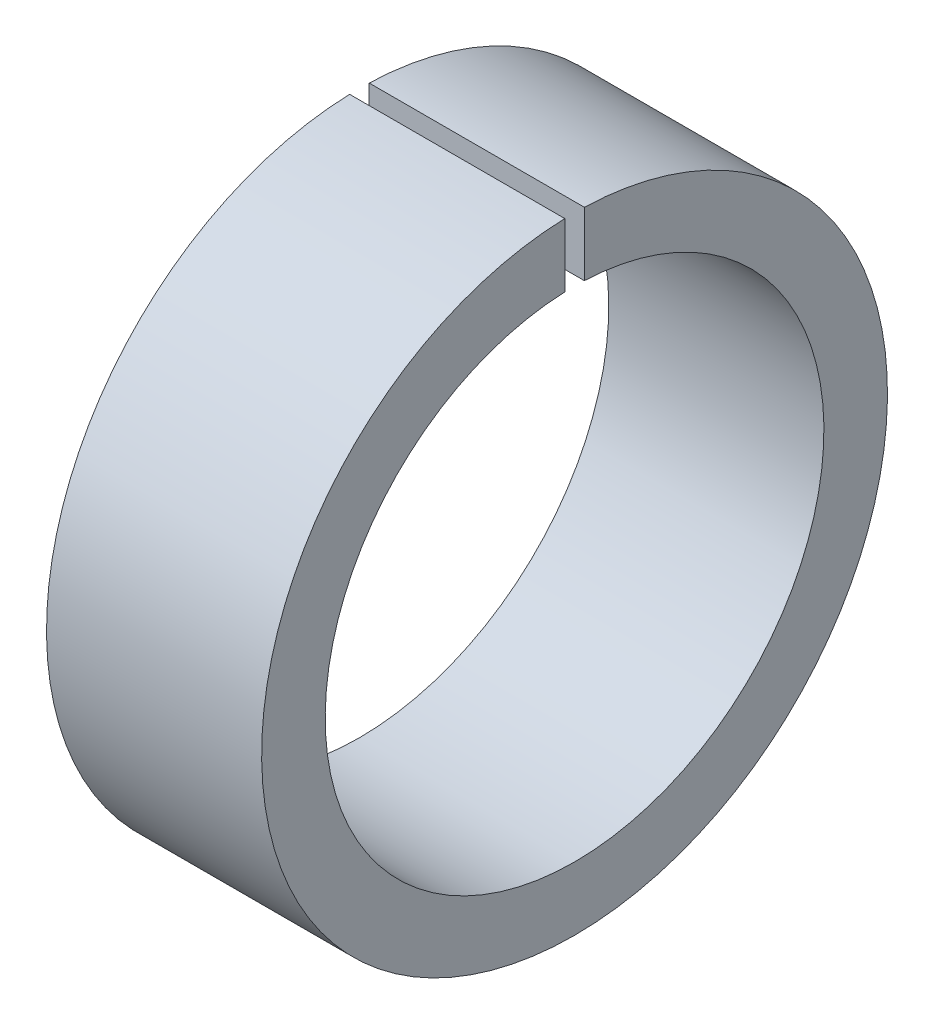
ISO-10303-21;
HEADER;
FILE_DESCRIPTION(('STEP AP214'),'2;1');
FILE_NAME('part.step','',(''),(''),'','','');
FILE_SCHEMA(('AUTOMOTIVE_DESIGN { 1 0 10303 214 1 1 1 1 }'));
ENDSEC;
DATA;
#1=APPLICATION_CONTEXT('core data for automotive mechanical design processes');
#2=APPLICATION_PROTOCOL_DEFINITION('international standard','automotive_design',2000,#1);
#3=PRODUCT_CONTEXT('',#1,'mechanical');
#4=PRODUCT('Part','Part','',(#3));
#5=PRODUCT_RELATED_PRODUCT_CATEGORY('part','',(#4));
#6=PRODUCT_DEFINITION_FORMATION('','',#4);
#7=PRODUCT_DEFINITION_CONTEXT('part definition',#1,'design');
#8=PRODUCT_DEFINITION('design','',#6,#7);
#9=PRODUCT_DEFINITION_SHAPE('','',#8);
#10=(LENGTH_UNIT() NAMED_UNIT(*) SI_UNIT(.MILLI.,.METRE.));
#11=(NAMED_UNIT(*) PLANE_ANGLE_UNIT() SI_UNIT($,.RADIAN.));
#12=(NAMED_UNIT(*) SI_UNIT($,.STERADIAN.) SOLID_ANGLE_UNIT());
#13=UNCERTAINTY_MEASURE_WITH_UNIT(LENGTH_MEASURE(1.E-05),#10,'distance_accuracy_value','');
#14=(GEOMETRIC_REPRESENTATION_CONTEXT(3) GLOBAL_UNCERTAINTY_ASSIGNED_CONTEXT((#13)) GLOBAL_UNIT_ASSIGNED_CONTEXT((#10,
#11,#12)) REPRESENTATION_CONTEXT('',''));
#15=CARTESIAN_POINT('',(0.,0.,0.));
#16=DIRECTION('',(0.,0.,1.));
#17=DIRECTION('',(1.,0.,0.));
#18=AXIS2_PLACEMENT_3D('',#15,#16,#17);
#19=CARTESIAN_POINT('',(11.,0.,0.));
#20=DIRECTION('',(1.,0.,0.));
#21=DIRECTION('',(0.,0.,-1.));
#22=AXIS2_PLACEMENT_3D('',#19,#20,#21);
#23=PLANE('',#22);
#24=DIRECTION('',(0.,-1.,0.));
#25=VECTOR('',#24,1.);
#26=CARTESIAN_POINT('',(11.,-3.26774551468841,0.5));
#27=LINE('',#26,#25);
#28=CARTESIAN_POINT('',(11.,15.9921855917195,0.5));
#29=VERTEX_POINT('',#28);
#30=CARTESIAN_POINT('',(11.,12.7401923062409,0.5));
#31=VERTEX_POINT('',#30);
#32=EDGE_CURVE('E62',#29,#31,#27,.T.);
#33=ORIENTED_EDGE('',*,*,#32,.F.);
#34=CARTESIAN_POINT('',(11.,0.,0.));
#35=DIRECTION('',(1.,0.,0.));
#36=DIRECTION('',(0.,0.,-1.));
#37=AXIS2_PLACEMENT_3D('',#34,#35,#36);
#38=CIRCLE('',#37,16.);
#39=CARTESIAN_POINT('',(11.,15.9921855917195,-0.5));
#40=VERTEX_POINT('',#39);
#41=EDGE_CURVE('E94',#29,#40,#38,.T.);
#42=ORIENTED_EDGE('',*,*,#41,.T.);
#43=DIRECTION('',(0.,1.,0.));
#44=VECTOR('',#43,1.);
#45=CARTESIAN_POINT('',(11.,-3.26774551468841,-0.500000000000005));
#46=LINE('',#45,#44);
#47=CARTESIAN_POINT('',(11.,12.7401923062409,-0.500000000000001));
#48=VERTEX_POINT('',#47);
#49=EDGE_CURVE('E98',#48,#40,#46,.T.);
#50=ORIENTED_EDGE('',*,*,#49,.F.);
#51=CARTESIAN_POINT('',(11.,0.,0.));
#52=DIRECTION('',(1.,0.,0.));
#53=DIRECTION('',(0.,0.,-1.));
#54=AXIS2_PLACEMENT_3D('',#51,#52,#53);
#55=CIRCLE('',#54,12.75);
#56=EDGE_CURVE('E96',#31,#48,#55,.T.);
#57=ORIENTED_EDGE('',*,*,#56,.F.);
#58=EDGE_LOOP('',(#33,#42,#50,#57));
#59=FACE_BOUND('',#58,.T.);
#60=ADVANCED_FACE('F39',(#59),#23,.T.);
#61=CARTESIAN_POINT('',(0.,0.,0.));
#62=DIRECTION('',(1.,0.,0.));
#63=DIRECTION('',(0.,0.,-1.));
#64=AXIS2_PLACEMENT_3D('',#61,#62,#63);
#65=PLANE('',#64);
#66=CARTESIAN_POINT('',(0.,0.,0.));
#67=DIRECTION('',(1.,0.,0.));
#68=DIRECTION('',(0.,0.,-1.));
#69=AXIS2_PLACEMENT_3D('',#66,#67,#68);
#70=CIRCLE('',#69,16.);
#71=CARTESIAN_POINT('',(0.,15.9921855917195,0.5));
#72=VERTEX_POINT('',#71);
#73=CARTESIAN_POINT('',(0.,15.9921855917195,-0.5));
#74=VERTEX_POINT('',#73);
#75=EDGE_CURVE('E102',#72,#74,#70,.T.);
#76=ORIENTED_EDGE('',*,*,#75,.F.);
#77=DIRECTION('',(0.,-1.,0.));
#78=VECTOR('',#77,1.);
#79=CARTESIAN_POINT('',(0.,-3.26774551468841,0.5));
#80=LINE('',#79,#78);
#81=CARTESIAN_POINT('',(0.,12.7401923062409,0.5));
#82=VERTEX_POINT('',#81);
#83=EDGE_CURVE('E81',#72,#82,#80,.T.);
#84=ORIENTED_EDGE('',*,*,#83,.T.);
#85=CARTESIAN_POINT('',(0.,0.,0.));
#86=DIRECTION('',(1.,0.,0.));
#87=DIRECTION('',(0.,0.,-1.));
#88=AXIS2_PLACEMENT_3D('',#85,#86,#87);
#89=CIRCLE('',#88,12.75);
#90=CARTESIAN_POINT('',(0.,12.7401923062409,-0.500000000000001));
#91=VERTEX_POINT('',#90);
#92=EDGE_CURVE('E87',#82,#91,#89,.T.);
#93=ORIENTED_EDGE('',*,*,#92,.T.);
#94=DIRECTION('',(0.,1.,0.));
#95=VECTOR('',#94,1.);
#96=CARTESIAN_POINT('',(0.,-3.26774551468841,-0.500000000000005));
#97=LINE('',#96,#95);
#98=EDGE_CURVE('E55',#91,#74,#97,.T.);
#99=ORIENTED_EDGE('',*,*,#98,.T.);
#100=EDGE_LOOP('',(#76,#84,#93,#99));
#101=FACE_BOUND('',#100,.T.);
#102=ADVANCED_FACE('F122',(#101),#65,.F.);
#103=CARTESIAN_POINT('',(11.,0.,0.));
#104=DIRECTION('',(-1.,0.,0.));
#105=DIRECTION('',(0.,0.,1.));
#106=AXIS2_PLACEMENT_3D('',#103,#104,#105);
#107=CYLINDRICAL_SURFACE('',#106,16.);
#108=ORIENTED_EDGE('',*,*,#41,.F.);
#109=DIRECTION('',(-1.,0.,0.));
#110=VECTOR('',#109,1.);
#111=CARTESIAN_POINT('',(11.,15.9921855917195,0.5));
#112=LINE('',#111,#110);
#113=EDGE_CURVE('E78',#29,#72,#112,.T.);
#114=ORIENTED_EDGE('',*,*,#113,.T.);
#115=ORIENTED_EDGE('',*,*,#75,.T.);
#116=DIRECTION('',(-1.,0.,0.));
#117=VECTOR('',#116,1.);
#118=CARTESIAN_POINT('',(11.,15.9921855917195,-0.5));
#119=LINE('',#118,#117);
#120=EDGE_CURVE('E88',#74,#40,#119,.F.);
#121=ORIENTED_EDGE('',*,*,#120,.T.);
#122=EDGE_LOOP('',(#108,#114,#115,#121));
#123=FACE_BOUND('',#122,.T.);
#124=ADVANCED_FACE('F41',(#123),#107,.T.);
#125=CARTESIAN_POINT('',(11.,0.,0.));
#126=DIRECTION('',(-1.,0.,0.));
#127=DIRECTION('',(0.,0.,1.));
#128=AXIS2_PLACEMENT_3D('',#125,#126,#127);
#129=CYLINDRICAL_SURFACE('',#128,12.75);
#130=DIRECTION('',(-1.,0.,0.));
#131=VECTOR('',#130,1.);
#132=CARTESIAN_POINT('',(11.,12.7401923062409,0.5));
#133=LINE('',#132,#131);
#134=EDGE_CURVE('E11',#31,#82,#133,.T.);
#135=ORIENTED_EDGE('',*,*,#134,.F.);
#136=ORIENTED_EDGE('',*,*,#56,.T.);
#137=DIRECTION('',(-1.,0.,0.));
#138=VECTOR('',#137,1.);
#139=CARTESIAN_POINT('',(11.,12.7401923062409,-0.500000000000001));
#140=LINE('',#139,#138);
#141=EDGE_CURVE('E48',#91,#48,#140,.F.);
#142=ORIENTED_EDGE('',*,*,#141,.F.);
#143=ORIENTED_EDGE('',*,*,#92,.F.);
#144=EDGE_LOOP('',(#135,#136,#142,#143));
#145=FACE_BOUND('',#144,.T.);
#146=ADVANCED_FACE('F124',(#145),#129,.F.);
#147=CARTESIAN_POINT('',(0.,-3.26774551468841,-0.500000000000005));
#148=DIRECTION('',(0.,0.,-1.));
#149=DIRECTION('',(0.,1.,0.));
#150=AXIS2_PLACEMENT_3D('',#147,#148,#149);
#151=PLANE('',#150);
#152=ORIENTED_EDGE('',*,*,#98,.F.);
#153=ORIENTED_EDGE('',*,*,#141,.T.);
#154=ORIENTED_EDGE('',*,*,#49,.T.);
#155=ORIENTED_EDGE('',*,*,#120,.F.);
#156=EDGE_LOOP('',(#152,#153,#154,#155));
#157=FACE_BOUND('',#156,.T.);
#158=ADVANCED_FACE('F125',(#157),#151,.F.);
#159=CARTESIAN_POINT('',(0.,-3.26774551468841,0.5));
#160=DIRECTION('',(0.,0.,1.));
#161=DIRECTION('',(1.,0.,0.));
#162=AXIS2_PLACEMENT_3D('',#159,#160,#161);
#163=PLANE('',#162);
#164=ORIENTED_EDGE('',*,*,#32,.T.);
#165=ORIENTED_EDGE('',*,*,#134,.T.);
#166=ORIENTED_EDGE('',*,*,#83,.F.);
#167=ORIENTED_EDGE('',*,*,#113,.F.);
#168=EDGE_LOOP('',(#164,#165,#166,#167));
#169=FACE_BOUND('',#168,.T.);
#170=ADVANCED_FACE('F79',(#169),#163,.F.);
#171=CLOSED_SHELL('',(#60,#102,#124,#146,#158,#170));
#172=MANIFOLD_SOLID_BREP('B2',#171);
#173=ADVANCED_BREP_SHAPE_REPRESENTATION('',(#18,#172),#14);
#174=SHAPE_DEFINITION_REPRESENTATION(#9,#173);
ENDSEC;
END-ISO-10303-21;
